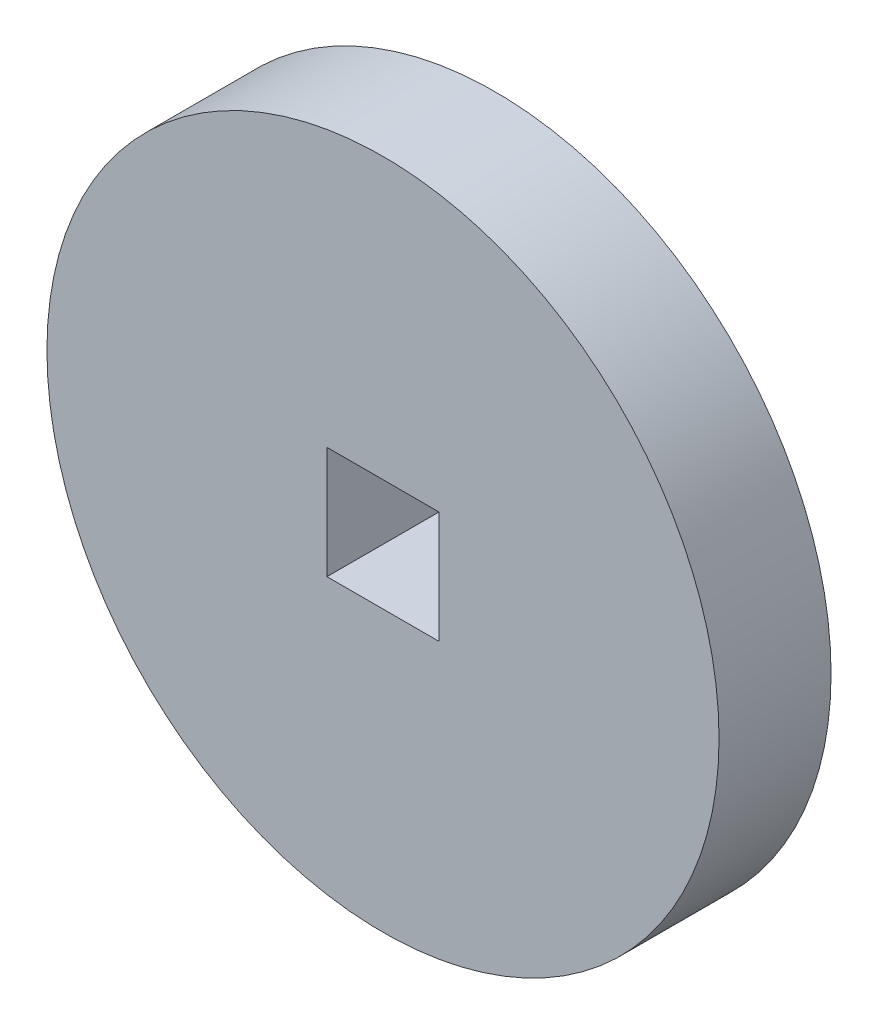
ISO-10303-21;
HEADER;
FILE_DESCRIPTION(('STEP AP214'),'2;1');
FILE_NAME('part.step','',(''),(''),'','','');
FILE_SCHEMA(('AUTOMOTIVE_DESIGN { 1 0 10303 214 1 1 1 1 }'));
ENDSEC;
DATA;
#1=APPLICATION_CONTEXT('core data for automotive mechanical design processes');
#2=APPLICATION_PROTOCOL_DEFINITION('international standard','automotive_design',2000,#1);
#3=PRODUCT_CONTEXT('',#1,'mechanical');
#4=PRODUCT('Part','Part','',(#3));
#5=PRODUCT_RELATED_PRODUCT_CATEGORY('part','',(#4));
#6=PRODUCT_DEFINITION_FORMATION('','',#4);
#7=PRODUCT_DEFINITION_CONTEXT('part definition',#1,'design');
#8=PRODUCT_DEFINITION('design','',#6,#7);
#9=PRODUCT_DEFINITION_SHAPE('','',#8);
#10=(LENGTH_UNIT() NAMED_UNIT(*) SI_UNIT(.MILLI.,.METRE.));
#11=(NAMED_UNIT(*) PLANE_ANGLE_UNIT() SI_UNIT($,.RADIAN.));
#12=(NAMED_UNIT(*) SI_UNIT($,.STERADIAN.) SOLID_ANGLE_UNIT());
#13=UNCERTAINTY_MEASURE_WITH_UNIT(LENGTH_MEASURE(1.E-05),#10,'distance_accuracy_value','');
#14=(GEOMETRIC_REPRESENTATION_CONTEXT(3) GLOBAL_UNCERTAINTY_ASSIGNED_CONTEXT((#13)) GLOBAL_UNIT_ASSIGNED_CONTEXT((#10,
#11,#12)) REPRESENTATION_CONTEXT('',''));
#15=CARTESIAN_POINT('',(0.,0.,0.));
#16=DIRECTION('',(0.,0.,1.));
#17=DIRECTION('',(1.,0.,0.));
#18=AXIS2_PLACEMENT_3D('',#15,#16,#17);
#19=CARTESIAN_POINT('',(0.,0.,-10.));
#20=DIRECTION('',(0.,0.,1.));
#21=DIRECTION('',(1.,0.,0.));
#22=AXIS2_PLACEMENT_3D('',#19,#20,#21);
#23=CYLINDRICAL_SURFACE('',#22,30.);
#24=CARTESIAN_POINT('',(0.,0.,-10.));
#25=DIRECTION('',(0.,0.,1.));
#26=DIRECTION('',(1.,0.,0.));
#27=AXIS2_PLACEMENT_3D('',#24,#25,#26);
#28=CIRCLE('',#27,30.);
#29=CARTESIAN_POINT('',(30.,0.,-10.));
#30=VERTEX_POINT('',#29);
#31=EDGE_CURVE('E11',#30,#30,#28,.T.);
#32=ORIENTED_EDGE('',*,*,#31,.T.);
#33=EDGE_LOOP('',(#32));
#34=FACE_BOUND('',#33,.T.);
#35=CARTESIAN_POINT('',(0.,0.,0.));
#36=DIRECTION('',(0.,0.,1.));
#37=DIRECTION('',(1.,0.,0.));
#38=AXIS2_PLACEMENT_3D('',#35,#36,#37);
#39=CIRCLE('',#38,30.);
#40=CARTESIAN_POINT('',(30.,0.,0.));
#41=VERTEX_POINT('',#40);
#42=EDGE_CURVE('E36',#41,#41,#39,.T.);
#43=ORIENTED_EDGE('',*,*,#42,.F.);
#44=EDGE_LOOP('',(#43));
#45=FACE_BOUND('',#44,.T.);
#46=ADVANCED_FACE('F33',(#34,#45),#23,.T.);
#47=CARTESIAN_POINT('',(0.,0.,-10.));
#48=DIRECTION('',(0.,0.,1.));
#49=DIRECTION('',(1.,0.,0.));
#50=AXIS2_PLACEMENT_3D('',#47,#48,#49);
#51=PLANE('',#50);
#52=DIRECTION('',(1.,0.,0.));
#53=VECTOR('',#52,1.);
#54=CARTESIAN_POINT('',(-5.,-5.,-10.));
#55=LINE('',#54,#53);
#56=CARTESIAN_POINT('',(-5.,-5.,-10.));
#57=VERTEX_POINT('',#56);
#58=CARTESIAN_POINT('',(5.,-5.,-10.));
#59=VERTEX_POINT('',#58);
#60=EDGE_CURVE('E81',#57,#59,#55,.T.);
#61=ORIENTED_EDGE('',*,*,#60,.T.);
#62=DIRECTION('',(0.,1.,0.));
#63=VECTOR('',#62,1.);
#64=CARTESIAN_POINT('',(5.,5.,-10.));
#65=LINE('',#64,#63);
#66=CARTESIAN_POINT('',(5.,5.,-10.));
#67=VERTEX_POINT('',#66);
#68=EDGE_CURVE('E75',#59,#67,#65,.T.);
#69=ORIENTED_EDGE('',*,*,#68,.T.);
#70=DIRECTION('',(-1.,0.,0.));
#71=VECTOR('',#70,1.);
#72=CARTESIAN_POINT('',(-5.,5.,-10.));
#73=LINE('',#72,#71);
#74=CARTESIAN_POINT('',(-5.,5.,-10.));
#75=VERTEX_POINT('',#74);
#76=EDGE_CURVE('E84',#67,#75,#73,.T.);
#77=ORIENTED_EDGE('',*,*,#76,.T.);
#78=DIRECTION('',(0.,-1.,0.));
#79=VECTOR('',#78,1.);
#80=CARTESIAN_POINT('',(-5.,5.,-10.));
#81=LINE('',#80,#79);
#82=EDGE_CURVE('E47',#75,#57,#81,.T.);
#83=ORIENTED_EDGE('',*,*,#82,.T.);
#84=EDGE_LOOP('',(#61,#69,#77,#83));
#85=FACE_BOUND('',#84,.T.);
#86=ORIENTED_EDGE('',*,*,#31,.F.);
#87=EDGE_LOOP('',(#86));
#88=FACE_BOUND('',#87,.T.);
#89=ADVANCED_FACE('F88',(#85,#88),#51,.F.);
#90=CARTESIAN_POINT('',(0.,0.,0.));
#91=DIRECTION('',(0.,0.,1.));
#92=DIRECTION('',(1.,0.,0.));
#93=AXIS2_PLACEMENT_3D('',#90,#91,#92);
#94=PLANE('',#93);
#95=DIRECTION('',(0.,1.,0.));
#96=VECTOR('',#95,1.);
#97=CARTESIAN_POINT('',(5.,5.,0.));
#98=LINE('',#97,#96);
#99=CARTESIAN_POINT('',(5.,-5.,0.));
#100=VERTEX_POINT('',#99);
#101=CARTESIAN_POINT('',(5.,5.,0.));
#102=VERTEX_POINT('',#101);
#103=EDGE_CURVE('E55',#100,#102,#98,.T.);
#104=ORIENTED_EDGE('',*,*,#103,.F.);
#105=DIRECTION('',(1.,0.,0.));
#106=VECTOR('',#105,1.);
#107=CARTESIAN_POINT('',(-5.,-5.,0.));
#108=LINE('',#107,#106);
#109=CARTESIAN_POINT('',(-5.,-5.,0.));
#110=VERTEX_POINT('',#109);
#111=EDGE_CURVE('E91',#110,#100,#108,.T.);
#112=ORIENTED_EDGE('',*,*,#111,.F.);
#113=DIRECTION('',(0.,-1.,0.));
#114=VECTOR('',#113,1.);
#115=CARTESIAN_POINT('',(-5.,5.,0.));
#116=LINE('',#115,#114);
#117=CARTESIAN_POINT('',(-5.,5.,0.));
#118=VERTEX_POINT('',#117);
#119=EDGE_CURVE('E94',#118,#110,#116,.T.);
#120=ORIENTED_EDGE('',*,*,#119,.F.);
#121=DIRECTION('',(-1.,0.,0.));
#122=VECTOR('',#121,1.);
#123=CARTESIAN_POINT('',(-5.,5.,0.));
#124=LINE('',#123,#122);
#125=EDGE_CURVE('E100',#102,#118,#124,.T.);
#126=ORIENTED_EDGE('',*,*,#125,.F.);
#127=EDGE_LOOP('',(#104,#112,#120,#126));
#128=FACE_BOUND('',#127,.T.);
#129=ORIENTED_EDGE('',*,*,#42,.T.);
#130=EDGE_LOOP('',(#129));
#131=FACE_BOUND('',#130,.T.);
#132=ADVANCED_FACE('F112',(#128,#131),#94,.T.);
#133=CARTESIAN_POINT('',(5.,5.,-10.));
#134=DIRECTION('',(1.,0.,0.));
#135=DIRECTION('',(0.,1.,0.));
#136=AXIS2_PLACEMENT_3D('',#133,#134,#135);
#137=PLANE('',#136);
#138=ORIENTED_EDGE('',*,*,#103,.T.);
#139=DIRECTION('',(0.,0.,1.));
#140=VECTOR('',#139,1.);
#141=CARTESIAN_POINT('',(5.,5.,-10.));
#142=LINE('',#141,#140);
#143=EDGE_CURVE('E71',#67,#102,#142,.T.);
#144=ORIENTED_EDGE('',*,*,#143,.F.);
#145=ORIENTED_EDGE('',*,*,#68,.F.);
#146=DIRECTION('',(0.,0.,1.));
#147=VECTOR('',#146,1.);
#148=CARTESIAN_POINT('',(5.,-5.,-10.));
#149=LINE('',#148,#147);
#150=EDGE_CURVE('E104',#59,#100,#149,.T.);
#151=ORIENTED_EDGE('',*,*,#150,.T.);
#152=EDGE_LOOP('',(#138,#144,#145,#151));
#153=FACE_BOUND('',#152,.T.);
#154=ADVANCED_FACE('F73',(#153),#137,.F.);
#155=CARTESIAN_POINT('',(-5.,-5.,-10.));
#156=DIRECTION('',(0.,-1.,0.));
#157=DIRECTION('',(0.,0.,-1.));
#158=AXIS2_PLACEMENT_3D('',#155,#156,#157);
#159=PLANE('',#158);
#160=ORIENTED_EDGE('',*,*,#111,.T.);
#161=ORIENTED_EDGE('',*,*,#150,.F.);
#162=ORIENTED_EDGE('',*,*,#60,.F.);
#163=DIRECTION('',(0.,0.,1.));
#164=VECTOR('',#163,1.);
#165=CARTESIAN_POINT('',(-5.,-5.,-10.));
#166=LINE('',#165,#164);
#167=EDGE_CURVE('E106',#57,#110,#166,.T.);
#168=ORIENTED_EDGE('',*,*,#167,.T.);
#169=EDGE_LOOP('',(#160,#161,#162,#168));
#170=FACE_BOUND('',#169,.T.);
#171=ADVANCED_FACE('F115',(#170),#159,.F.);
#172=CARTESIAN_POINT('',(-5.,5.,-10.));
#173=DIRECTION('',(-1.,0.,0.));
#174=DIRECTION('',(0.,-1.,0.));
#175=AXIS2_PLACEMENT_3D('',#172,#173,#174);
#176=PLANE('',#175);
#177=ORIENTED_EDGE('',*,*,#119,.T.);
#178=ORIENTED_EDGE('',*,*,#167,.F.);
#179=ORIENTED_EDGE('',*,*,#82,.F.);
#180=DIRECTION('',(0.,0.,1.));
#181=VECTOR('',#180,1.);
#182=CARTESIAN_POINT('',(-5.,5.,-10.));
#183=LINE('',#182,#181);
#184=EDGE_CURVE('E80',#75,#118,#183,.T.);
#185=ORIENTED_EDGE('',*,*,#184,.T.);
#186=EDGE_LOOP('',(#177,#178,#179,#185));
#187=FACE_BOUND('',#186,.T.);
#188=ADVANCED_FACE('F108',(#187),#176,.F.);
#189=CARTESIAN_POINT('',(-5.,5.,-10.));
#190=DIRECTION('',(0.,1.,0.));
#191=DIRECTION('',(0.,0.,1.));
#192=AXIS2_PLACEMENT_3D('',#189,#190,#191);
#193=PLANE('',#192);
#194=ORIENTED_EDGE('',*,*,#125,.T.);
#195=ORIENTED_EDGE('',*,*,#184,.F.);
#196=ORIENTED_EDGE('',*,*,#76,.F.);
#197=ORIENTED_EDGE('',*,*,#143,.T.);
#198=EDGE_LOOP('',(#194,#195,#196,#197));
#199=FACE_BOUND('',#198,.T.);
#200=ADVANCED_FACE('F85',(#199),#193,.F.);
#201=CLOSED_SHELL('',(#46,#89,#132,#154,#171,#188,#200));
#202=MANIFOLD_SOLID_BREP('B2',#201);
#203=ADVANCED_BREP_SHAPE_REPRESENTATION('',(#18,#202),#14);
#204=SHAPE_DEFINITION_REPRESENTATION(#9,#203);
ENDSEC;
END-ISO-10303-21;
